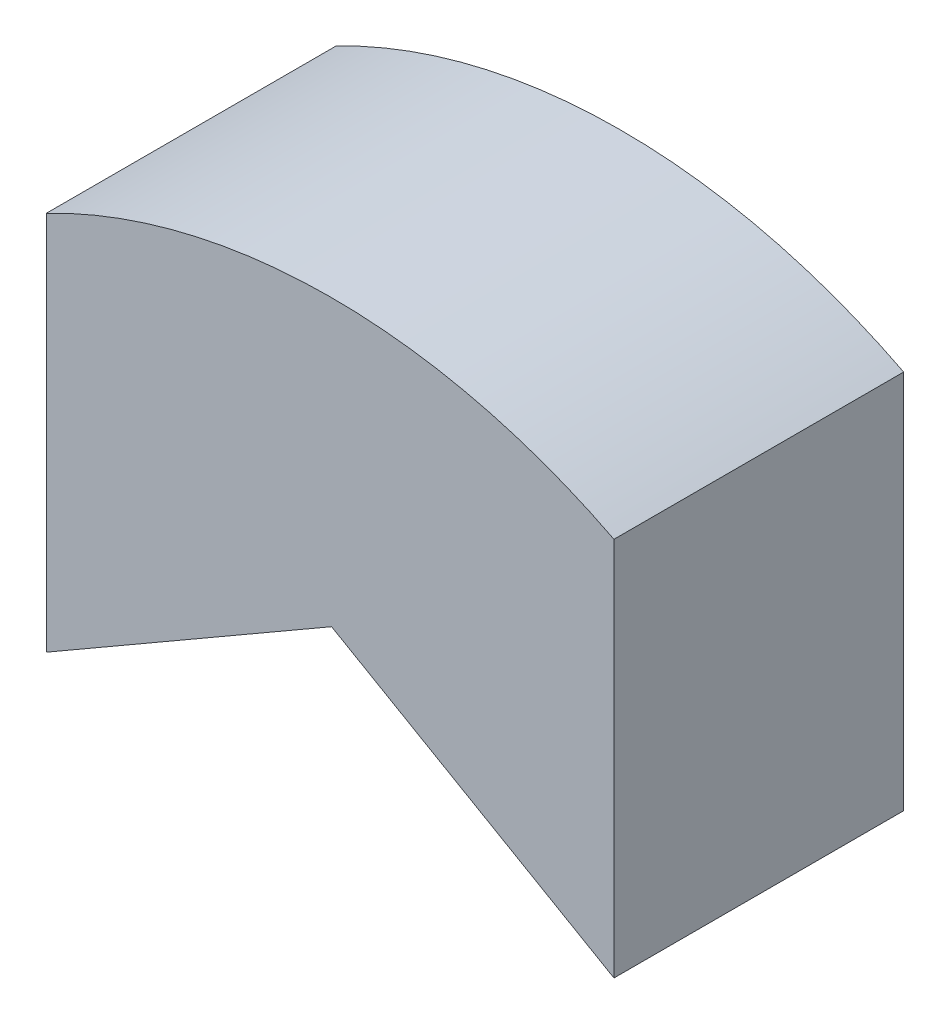
ISO-10303-21;
HEADER;
FILE_DESCRIPTION(('STEP AP214'),'2;1');
FILE_NAME('part.step','',(''),(''),'','','');
FILE_SCHEMA(('AUTOMOTIVE_DESIGN { 1 0 10303 214 1 1 1 1 }'));
ENDSEC;
DATA;
#1=APPLICATION_CONTEXT('core data for automotive mechanical design processes');
#2=APPLICATION_PROTOCOL_DEFINITION('international standard','automotive_design',2000,#1);
#3=PRODUCT_CONTEXT('',#1,'mechanical');
#4=PRODUCT('Part','Part','',(#3));
#5=PRODUCT_RELATED_PRODUCT_CATEGORY('part','',(#4));
#6=PRODUCT_DEFINITION_FORMATION('','',#4);
#7=PRODUCT_DEFINITION_CONTEXT('part definition',#1,'design');
#8=PRODUCT_DEFINITION('design','',#6,#7);
#9=PRODUCT_DEFINITION_SHAPE('','',#8);
#10=(LENGTH_UNIT() NAMED_UNIT(*) SI_UNIT(.MILLI.,.METRE.));
#11=(NAMED_UNIT(*) PLANE_ANGLE_UNIT() SI_UNIT($,.RADIAN.));
#12=(NAMED_UNIT(*) SI_UNIT($,.STERADIAN.) SOLID_ANGLE_UNIT());
#13=UNCERTAINTY_MEASURE_WITH_UNIT(LENGTH_MEASURE(1.E-05),#10,'distance_accuracy_value','');
#14=(GEOMETRIC_REPRESENTATION_CONTEXT(3) GLOBAL_UNCERTAINTY_ASSIGNED_CONTEXT((#13)) GLOBAL_UNIT_ASSIGNED_CONTEXT((#10,
#11,#12)) REPRESENTATION_CONTEXT('',''));
#15=CARTESIAN_POINT('',(0.,0.,0.));
#16=DIRECTION('',(0.,0.,1.));
#17=DIRECTION('',(1.,0.,0.));
#18=AXIS2_PLACEMENT_3D('',#15,#16,#17);
#19=CARTESIAN_POINT('',(0.,0.,6.5));
#20=DIRECTION('',(0.,0.,-1.));
#21=DIRECTION('',(-1.,0.,0.));
#22=AXIS2_PLACEMENT_3D('',#19,#20,#21);
#23=CYLINDRICAL_SURFACE('',#22,13.9);
#24=CARTESIAN_POINT('',(0.,0.,0.));
#25=DIRECTION('',(0.,0.,1.));
#26=DIRECTION('',(1.,0.,0.));
#27=AXIS2_PLACEMENT_3D('',#24,#25,#26);
#28=CIRCLE('',#27,13.9);
#29=CARTESIAN_POINT('',(6.33549820462922,12.3722052399376,0.));
#30=VERTEX_POINT('',#29);
#31=CARTESIAN_POINT('',(-6.4,12.3389626792531,0.));
#32=VERTEX_POINT('',#31);
#33=EDGE_CURVE('E107',#30,#32,#28,.T.);
#34=ORIENTED_EDGE('',*,*,#33,.T.);
#35=DIRECTION('',(0.,0.,-1.));
#36=VECTOR('',#35,1.);
#37=CARTESIAN_POINT('',(-6.4,12.3389626792531,6.5));
#38=LINE('',#37,#36);
#39=CARTESIAN_POINT('',(-6.4,12.3389626792531,6.5));
#40=VERTEX_POINT('',#39);
#41=EDGE_CURVE('E11',#40,#32,#38,.T.);
#42=ORIENTED_EDGE('',*,*,#41,.F.);
#43=CARTESIAN_POINT('',(0.,0.,6.5));
#44=DIRECTION('',(0.,0.,1.));
#45=DIRECTION('',(1.,0.,0.));
#46=AXIS2_PLACEMENT_3D('',#43,#44,#45);
#47=CIRCLE('',#46,13.9);
#48=CARTESIAN_POINT('',(6.33549820462922,12.3722052399376,6.5));
#49=VERTEX_POINT('',#48);
#50=EDGE_CURVE('E115',#49,#40,#47,.T.);
#51=ORIENTED_EDGE('',*,*,#50,.F.);
#52=DIRECTION('',(0.,0.,-1.));
#53=VECTOR('',#52,1.);
#54=CARTESIAN_POINT('',(6.33549820462922,12.3722052399376,6.5));
#55=LINE('',#54,#53);
#56=EDGE_CURVE('E103',#49,#30,#55,.T.);
#57=ORIENTED_EDGE('',*,*,#56,.T.);
#58=EDGE_LOOP('',(#34,#42,#51,#57));
#59=FACE_BOUND('',#58,.T.);
#60=ADVANCED_FACE('F33',(#59),#23,.T.);
#61=CARTESIAN_POINT('',(-6.4,12.3389626792531,6.5));
#62=DIRECTION('',(1.,0.,0.));
#63=DIRECTION('',(0.,0.,-1.));
#64=AXIS2_PLACEMENT_3D('',#61,#62,#63);
#65=PLANE('',#64);
#66=DIRECTION('',(0.,-1.,0.));
#67=VECTOR('',#66,1.);
#68=CARTESIAN_POINT('',(-6.4,12.3389626792531,0.));
#69=LINE('',#68,#67);
#70=CARTESIAN_POINT('',(-6.4,3.81051177665153,0.));
#71=VERTEX_POINT('',#70);
#72=EDGE_CURVE('E110',#32,#71,#69,.T.);
#73=ORIENTED_EDGE('',*,*,#72,.T.);
#74=DIRECTION('',(0.,0.,-1.));
#75=VECTOR('',#74,1.);
#76=CARTESIAN_POINT('',(-6.4,3.81051177665153,6.5));
#77=LINE('',#76,#75);
#78=CARTESIAN_POINT('',(-6.4,3.81051177665153,6.5));
#79=VERTEX_POINT('',#78);
#80=EDGE_CURVE('E41',#79,#71,#77,.T.);
#81=ORIENTED_EDGE('',*,*,#80,.F.);
#82=DIRECTION('',(0.,-1.,0.));
#83=VECTOR('',#82,1.);
#84=CARTESIAN_POINT('',(-6.4,12.3389626792531,6.5));
#85=LINE('',#84,#83);
#86=EDGE_CURVE('E83',#40,#79,#85,.T.);
#87=ORIENTED_EDGE('',*,*,#86,.F.);
#88=ORIENTED_EDGE('',*,*,#41,.T.);
#89=EDGE_LOOP('',(#73,#81,#87,#88));
#90=FACE_BOUND('',#89,.T.);
#91=ADVANCED_FACE('F134',(#90),#65,.F.);
#92=CARTESIAN_POINT('',(0.,7.50555349946514,6.5));
#93=DIRECTION('',(-0.5,0.866025403784439,0.));
#94=DIRECTION('',(-0.866025403784439,-0.5,0.));
#95=AXIS2_PLACEMENT_3D('',#92,#93,#94);
#96=PLANE('',#95);
#97=DIRECTION('',(0.866025403784439,0.5,0.));
#98=VECTOR('',#97,1.);
#99=CARTESIAN_POINT('',(0.,7.50555349946514,0.));
#100=LINE('',#99,#98);
#101=CARTESIAN_POINT('',(0.,7.50555349946514,0.));
#102=VERTEX_POINT('',#101);
#103=EDGE_CURVE('E98',#71,#102,#100,.T.);
#104=ORIENTED_EDGE('',*,*,#103,.T.);
#105=DIRECTION('',(0.,0.,-1.));
#106=VECTOR('',#105,1.);
#107=CARTESIAN_POINT('',(0.,7.50555349946514,6.5));
#108=LINE('',#107,#106);
#109=CARTESIAN_POINT('',(0.,7.50555349946514,6.5));
#110=VERTEX_POINT('',#109);
#111=EDGE_CURVE('E95',#110,#102,#108,.T.);
#112=ORIENTED_EDGE('',*,*,#111,.F.);
#113=DIRECTION('',(0.866025403784439,0.5,0.));
#114=VECTOR('',#113,1.);
#115=CARTESIAN_POINT('',(0.,7.50555349946514,6.5));
#116=LINE('',#115,#114);
#117=EDGE_CURVE('E87',#79,#110,#116,.T.);
#118=ORIENTED_EDGE('',*,*,#117,.F.);
#119=ORIENTED_EDGE('',*,*,#80,.T.);
#120=EDGE_LOOP('',(#104,#112,#118,#119));
#121=FACE_BOUND('',#120,.T.);
#122=ADVANCED_FACE('F96',(#121),#96,.F.);
#123=CARTESIAN_POINT('',(6.33549820462922,3.84775190557207,6.5));
#124=DIRECTION('',(0.5,0.866025403784439,0.));
#125=DIRECTION('',(-0.866025403784439,0.5,0.));
#126=AXIS2_PLACEMENT_3D('',#123,#124,#125);
#127=PLANE('',#126);
#128=DIRECTION('',(0.866025403784439,-0.5,0.));
#129=VECTOR('',#128,1.);
#130=CARTESIAN_POINT('',(6.33549820462922,3.84775190557207,0.));
#131=LINE('',#130,#129);
#132=CARTESIAN_POINT('',(6.33549820462922,3.84775190557207,0.));
#133=VERTEX_POINT('',#132);
#134=EDGE_CURVE('E69',#102,#133,#131,.T.);
#135=ORIENTED_EDGE('',*,*,#134,.T.);
#136=DIRECTION('',(0.,0.,-1.));
#137=VECTOR('',#136,1.);
#138=CARTESIAN_POINT('',(6.33549820462922,3.84775190557207,6.5));
#139=LINE('',#138,#137);
#140=CARTESIAN_POINT('',(6.33549820462922,3.84775190557207,6.5));
#141=VERTEX_POINT('',#140);
#142=EDGE_CURVE('E99',#141,#133,#139,.T.);
#143=ORIENTED_EDGE('',*,*,#142,.F.);
#144=DIRECTION('',(0.866025403784439,-0.5,0.));
#145=VECTOR('',#144,1.);
#146=CARTESIAN_POINT('',(6.33549820462922,3.84775190557207,6.5));
#147=LINE('',#146,#145);
#148=EDGE_CURVE('E91',#110,#141,#147,.T.);
#149=ORIENTED_EDGE('',*,*,#148,.F.);
#150=ORIENTED_EDGE('',*,*,#111,.T.);
#151=EDGE_LOOP('',(#135,#143,#149,#150));
#152=FACE_BOUND('',#151,.T.);
#153=ADVANCED_FACE('F101',(#152),#127,.F.);
#154=CARTESIAN_POINT('',(6.33549820462922,3.84775190557207,6.5));
#155=DIRECTION('',(-1.,0.,0.));
#156=DIRECTION('',(0.,0.,1.));
#157=AXIS2_PLACEMENT_3D('',#154,#155,#156);
#158=PLANE('',#157);
#159=DIRECTION('',(0.,1.,0.));
#160=VECTOR('',#159,1.);
#161=CARTESIAN_POINT('',(6.33549820462922,3.84775190557207,0.));
#162=LINE('',#161,#160);
#163=EDGE_CURVE('E75',#133,#30,#162,.T.);
#164=ORIENTED_EDGE('',*,*,#163,.T.);
#165=ORIENTED_EDGE('',*,*,#56,.F.);
#166=DIRECTION('',(0.,1.,0.));
#167=VECTOR('',#166,1.);
#168=CARTESIAN_POINT('',(6.33549820462922,3.84775190557207,6.5));
#169=LINE('',#168,#167);
#170=EDGE_CURVE('E49',#141,#49,#169,.T.);
#171=ORIENTED_EDGE('',*,*,#170,.F.);
#172=ORIENTED_EDGE('',*,*,#142,.T.);
#173=EDGE_LOOP('',(#164,#165,#171,#172));
#174=FACE_BOUND('',#173,.T.);
#175=ADVANCED_FACE('F123',(#174),#158,.F.);
#176=CARTESIAN_POINT('',(0.,0.,6.5));
#177=DIRECTION('',(0.,0.,1.));
#178=DIRECTION('',(1.,0.,0.));
#179=AXIS2_PLACEMENT_3D('',#176,#177,#178);
#180=PLANE('',#179);
#181=ORIENTED_EDGE('',*,*,#50,.T.);
#182=ORIENTED_EDGE('',*,*,#86,.T.);
#183=ORIENTED_EDGE('',*,*,#117,.T.);
#184=ORIENTED_EDGE('',*,*,#148,.T.);
#185=ORIENTED_EDGE('',*,*,#170,.T.);
#186=EDGE_LOOP('',(#181,#182,#183,#184,#185));
#187=FACE_BOUND('',#186,.T.);
#188=ADVANCED_FACE('F89',(#187),#180,.T.);
#189=CARTESIAN_POINT('',(0.,0.,0.));
#190=DIRECTION('',(0.,0.,1.));
#191=DIRECTION('',(1.,0.,0.));
#192=AXIS2_PLACEMENT_3D('',#189,#190,#191);
#193=PLANE('',#192);
#194=ORIENTED_EDGE('',*,*,#33,.F.);
#195=ORIENTED_EDGE('',*,*,#163,.F.);
#196=ORIENTED_EDGE('',*,*,#134,.F.);
#197=ORIENTED_EDGE('',*,*,#103,.F.);
#198=ORIENTED_EDGE('',*,*,#72,.F.);
#199=EDGE_LOOP('',(#194,#195,#196,#197,#198));
#200=FACE_BOUND('',#199,.T.);
#201=ADVANCED_FACE('F119',(#200),#193,.F.);
#202=CLOSED_SHELL('',(#60,#91,#122,#153,#175,#188,#201));
#203=MANIFOLD_SOLID_BREP('B2',#202);
#204=ADVANCED_BREP_SHAPE_REPRESENTATION('',(#18,#203),#14);
#205=SHAPE_DEFINITION_REPRESENTATION(#9,#204);
ENDSEC;
END-ISO-10303-21;
